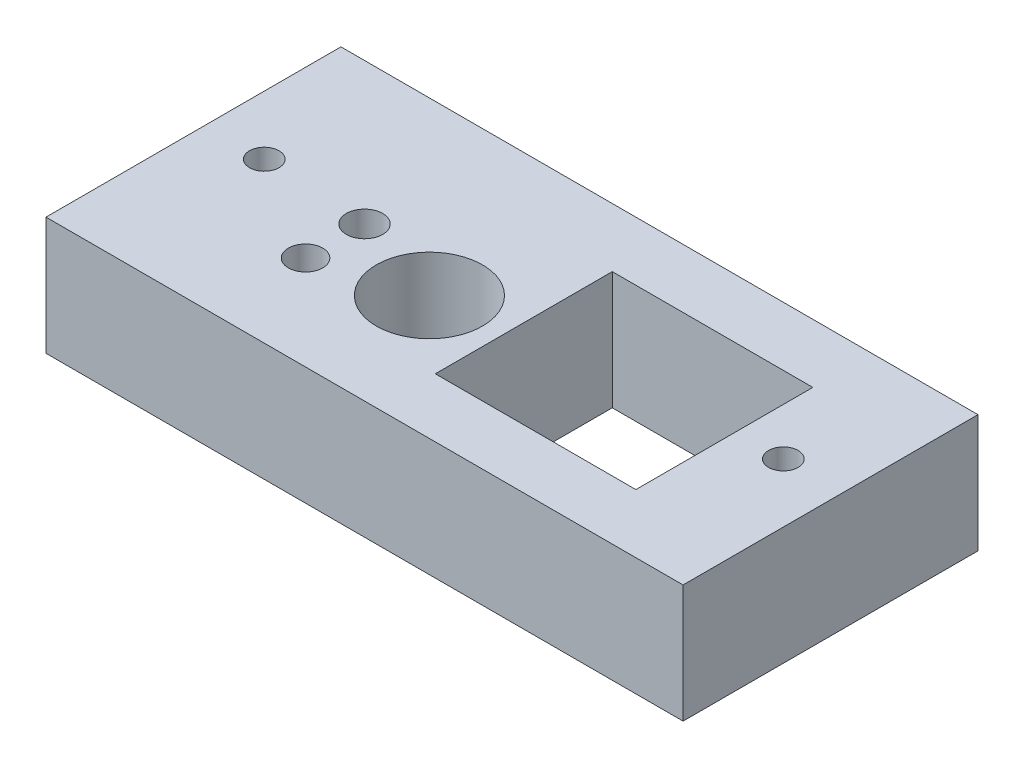
ISO-10303-21;
HEADER;
FILE_DESCRIPTION(('STEP AP214'),'2;1');
FILE_NAME('part.step','',(''),(''),'','','');
FILE_SCHEMA(('AUTOMOTIVE_DESIGN { 1 0 10303 214 1 1 1 1 }'));
ENDSEC;
DATA;
#1=APPLICATION_CONTEXT('core data for automotive mechanical design processes');
#2=APPLICATION_PROTOCOL_DEFINITION('international standard','automotive_design',2000,#1);
#3=PRODUCT_CONTEXT('',#1,'mechanical');
#4=PRODUCT('Part','Part','',(#3));
#5=PRODUCT_RELATED_PRODUCT_CATEGORY('part','',(#4));
#6=PRODUCT_DEFINITION_FORMATION('','',#4);
#7=PRODUCT_DEFINITION_CONTEXT('part definition',#1,'design');
#8=PRODUCT_DEFINITION('design','',#6,#7);
#9=PRODUCT_DEFINITION_SHAPE('','',#8);
#10=(LENGTH_UNIT() NAMED_UNIT(*) SI_UNIT(.MILLI.,.METRE.));
#11=(NAMED_UNIT(*) PLANE_ANGLE_UNIT() SI_UNIT($,.RADIAN.));
#12=(NAMED_UNIT(*) SI_UNIT($,.STERADIAN.) SOLID_ANGLE_UNIT());
#13=UNCERTAINTY_MEASURE_WITH_UNIT(LENGTH_MEASURE(1.E-05),#10,'distance_accuracy_value','');
#14=(GEOMETRIC_REPRESENTATION_CONTEXT(3) GLOBAL_UNCERTAINTY_ASSIGNED_CONTEXT((#13)) GLOBAL_UNIT_ASSIGNED_CONTEXT((#10,
#11,#12)) REPRESENTATION_CONTEXT('',''));
#15=CARTESIAN_POINT('',(0.,0.,0.));
#16=DIRECTION('',(0.,0.,1.));
#17=DIRECTION('',(1.,0.,0.));
#18=AXIS2_PLACEMENT_3D('',#15,#16,#17);
#19=CARTESIAN_POINT('',(0.,10.,0.));
#20=DIRECTION('',(1.,0.,0.));
#21=DIRECTION('',(0.,0.,-1.));
#22=AXIS2_PLACEMENT_3D('',#19,#20,#21);
#23=PLANE('',#22);
#24=DIRECTION('',(0.,0.,1.));
#25=VECTOR('',#24,1.);
#26=CARTESIAN_POINT('',(0.,0.,0.));
#27=LINE('',#26,#25);
#28=CARTESIAN_POINT('',(0.,0.,-25.));
#29=VERTEX_POINT('',#28);
#30=CARTESIAN_POINT('',(0.,0.,0.));
#31=VERTEX_POINT('',#30);
#32=EDGE_CURVE('E134',#29,#31,#27,.T.);
#33=ORIENTED_EDGE('',*,*,#32,.T.);
#34=DIRECTION('',(0.,-1.,0.));
#35=VECTOR('',#34,1.);
#36=CARTESIAN_POINT('',(0.,10.,0.));
#37=LINE('',#36,#35);
#38=CARTESIAN_POINT('',(0.,10.,0.));
#39=VERTEX_POINT('',#38);
#40=EDGE_CURVE('E11',#39,#31,#37,.T.);
#41=ORIENTED_EDGE('',*,*,#40,.F.);
#42=DIRECTION('',(0.,0.,1.));
#43=VECTOR('',#42,1.);
#44=CARTESIAN_POINT('',(0.,10.,0.));
#45=LINE('',#44,#43);
#46=CARTESIAN_POINT('',(0.,10.,-25.));
#47=VERTEX_POINT('',#46);
#48=EDGE_CURVE('E138',#47,#39,#45,.T.);
#49=ORIENTED_EDGE('',*,*,#48,.F.);
#50=DIRECTION('',(0.,-1.,0.));
#51=VECTOR('',#50,1.);
#52=CARTESIAN_POINT('',(0.,10.,-25.));
#53=LINE('',#52,#51);
#54=EDGE_CURVE('E148',#47,#29,#53,.T.);
#55=ORIENTED_EDGE('',*,*,#54,.T.);
#56=EDGE_LOOP('',(#33,#41,#49,#55));
#57=FACE_BOUND('',#56,.T.);
#58=ADVANCED_FACE('F33',(#57),#23,.F.);
#59=CARTESIAN_POINT('',(0.,10.,0.));
#60=DIRECTION('',(0.,0.,-1.));
#61=DIRECTION('',(-1.,0.,0.));
#62=AXIS2_PLACEMENT_3D('',#59,#60,#61);
#63=PLANE('',#62);
#64=DIRECTION('',(1.,0.,0.));
#65=VECTOR('',#64,1.);
#66=CARTESIAN_POINT('',(0.,0.,0.));
#67=LINE('',#66,#65);
#68=CARTESIAN_POINT('',(54.,0.,0.));
#69=VERTEX_POINT('',#68);
#70=EDGE_CURVE('E151',#31,#69,#67,.T.);
#71=ORIENTED_EDGE('',*,*,#70,.T.);
#72=DIRECTION('',(0.,-1.,0.));
#73=VECTOR('',#72,1.);
#74=CARTESIAN_POINT('',(54.,10.,0.));
#75=LINE('',#74,#73);
#76=CARTESIAN_POINT('',(54.,10.,0.));
#77=VERTEX_POINT('',#76);
#78=EDGE_CURVE('E40',#77,#69,#75,.T.);
#79=ORIENTED_EDGE('',*,*,#78,.F.);
#80=DIRECTION('',(1.,0.,0.));
#81=VECTOR('',#80,1.);
#82=CARTESIAN_POINT('',(0.,10.,0.));
#83=LINE('',#82,#81);
#84=EDGE_CURVE('E141',#39,#77,#83,.T.);
#85=ORIENTED_EDGE('',*,*,#84,.F.);
#86=ORIENTED_EDGE('',*,*,#40,.T.);
#87=EDGE_LOOP('',(#71,#79,#85,#86));
#88=FACE_BOUND('',#87,.T.);
#89=ADVANCED_FACE('F179',(#88),#63,.F.);
#90=CARTESIAN_POINT('',(54.,10.,0.));
#91=DIRECTION('',(-1.,0.,0.));
#92=DIRECTION('',(0.,0.,1.));
#93=AXIS2_PLACEMENT_3D('',#90,#91,#92);
#94=PLANE('',#93);
#95=DIRECTION('',(0.,0.,-1.));
#96=VECTOR('',#95,1.);
#97=CARTESIAN_POINT('',(54.,0.,0.));
#98=LINE('',#97,#96);
#99=CARTESIAN_POINT('',(54.,0.,-25.));
#100=VERTEX_POINT('',#99);
#101=EDGE_CURVE('E153',#69,#100,#98,.T.);
#102=ORIENTED_EDGE('',*,*,#101,.T.);
#103=DIRECTION('',(0.,-1.,0.));
#104=VECTOR('',#103,1.);
#105=CARTESIAN_POINT('',(54.,10.,-25.));
#106=LINE('',#105,#104);
#107=CARTESIAN_POINT('',(54.,10.,-25.));
#108=VERTEX_POINT('',#107);
#109=EDGE_CURVE('E158',#108,#100,#106,.T.);
#110=ORIENTED_EDGE('',*,*,#109,.F.);
#111=DIRECTION('',(0.,0.,-1.));
#112=VECTOR('',#111,1.);
#113=CARTESIAN_POINT('',(54.,10.,0.));
#114=LINE('',#113,#112);
#115=EDGE_CURVE('E144',#77,#108,#114,.T.);
#116=ORIENTED_EDGE('',*,*,#115,.F.);
#117=ORIENTED_EDGE('',*,*,#78,.T.);
#118=EDGE_LOOP('',(#102,#110,#116,#117));
#119=FACE_BOUND('',#118,.T.);
#120=ADVANCED_FACE('F165',(#119),#94,.F.);
#121=CARTESIAN_POINT('',(0.,10.,-25.));
#122=DIRECTION('',(0.,0.,1.));
#123=DIRECTION('',(1.,0.,0.));
#124=AXIS2_PLACEMENT_3D('',#121,#122,#123);
#125=PLANE('',#124);
#126=DIRECTION('',(-1.,0.,0.));
#127=VECTOR('',#126,1.);
#128=CARTESIAN_POINT('',(0.,0.,-25.));
#129=LINE('',#128,#127);
#130=EDGE_CURVE('E142',#100,#29,#129,.T.);
#131=ORIENTED_EDGE('',*,*,#130,.T.);
#132=ORIENTED_EDGE('',*,*,#54,.F.);
#133=DIRECTION('',(-1.,0.,0.));
#134=VECTOR('',#133,1.);
#135=CARTESIAN_POINT('',(0.,10.,-25.));
#136=LINE('',#135,#134);
#137=EDGE_CURVE('E146',#108,#47,#136,.T.);
#138=ORIENTED_EDGE('',*,*,#137,.F.);
#139=ORIENTED_EDGE('',*,*,#109,.T.);
#140=EDGE_LOOP('',(#131,#132,#138,#139));
#141=FACE_BOUND('',#140,.T.);
#142=ADVANCED_FACE('F172',(#141),#125,.F.);
#143=CARTESIAN_POINT('',(0.,10.,0.));
#144=DIRECTION('',(0.,-1.,0.));
#145=DIRECTION('',(0.,0.,-1.));
#146=AXIS2_PLACEMENT_3D('',#143,#144,#145);
#147=PLANE('',#146);
#148=CARTESIAN_POINT('',(14.,10.,-8.));
#149=DIRECTION('',(0.,1.,0.));
#150=DIRECTION('',(0.,0.,1.));
#151=AXIS2_PLACEMENT_3D('',#148,#149,#150);
#152=CIRCLE('',#151,1.45734545201175);
#153=CARTESIAN_POINT('',(14.,10.,-6.54265454798825));
#154=VERTEX_POINT('',#153);
#155=EDGE_CURVE('E233',#154,#154,#152,.T.);
#156=ORIENTED_EDGE('',*,*,#155,.F.);
#157=EDGE_LOOP('',(#156));
#158=FACE_BOUND('',#157,.T.);
#159=CARTESIAN_POINT('',(14.,10.,-13.));
#160=DIRECTION('',(0.,1.,0.));
#161=DIRECTION('',(0.,0.,1.));
#162=AXIS2_PLACEMENT_3D('',#159,#160,#161);
#163=CIRCLE('',#162,1.54169225657886);
#164=CARTESIAN_POINT('',(14.,10.,-11.4583077434211));
#165=VERTEX_POINT('',#164);
#166=EDGE_CURVE('E235',#165,#165,#163,.T.);
#167=ORIENTED_EDGE('',*,*,#166,.F.);
#168=EDGE_LOOP('',(#167));
#169=FACE_BOUND('',#168,.T.);
#170=CARTESIAN_POINT('',(22.,10.,-10.5));
#171=DIRECTION('',(0.,1.,0.));
#172=DIRECTION('',(0.,0.,1.));
#173=AXIS2_PLACEMENT_3D('',#170,#171,#172);
#174=CIRCLE('',#173,4.5);
#175=CARTESIAN_POINT('',(22.,10.,-6.));
#176=VERTEX_POINT('',#175);
#177=EDGE_CURVE('E241',#176,#176,#174,.T.);
#178=ORIENTED_EDGE('',*,*,#177,.F.);
#179=EDGE_LOOP('',(#178));
#180=FACE_BOUND('',#179,.T.);
#181=CARTESIAN_POINT('',(5.,10.,-13.5));
#182=DIRECTION('',(0.,1.,0.));
#183=DIRECTION('',(0.,0.,1.));
#184=AXIS2_PLACEMENT_3D('',#181,#182,#183);
#185=CIRCLE('',#184,1.25);
#186=CARTESIAN_POINT('',(5.,10.,-12.25));
#187=VERTEX_POINT('',#186);
#188=EDGE_CURVE('E247',#187,#187,#185,.T.);
#189=ORIENTED_EDGE('',*,*,#188,.F.);
#190=EDGE_LOOP('',(#189));
#191=FACE_BOUND('',#190,.T.);
#192=CARTESIAN_POINT('',(49.,10.,-13.5));
#193=DIRECTION('',(0.,1.,0.));
#194=DIRECTION('',(0.,0.,1.));
#195=AXIS2_PLACEMENT_3D('',#192,#193,#194);
#196=CIRCLE('',#195,1.25);
#197=CARTESIAN_POINT('',(49.,10.,-12.25));
#198=VERTEX_POINT('',#197);
#199=EDGE_CURVE('E121',#198,#198,#196,.T.);
#200=ORIENTED_EDGE('',*,*,#199,.F.);
#201=EDGE_LOOP('',(#200));
#202=FACE_BOUND('',#201,.T.);
#203=DIRECTION('',(1.,0.,0.));
#204=VECTOR('',#203,1.);
#205=CARTESIAN_POINT('',(28.,10.,-5.));
#206=LINE('',#205,#204);
#207=CARTESIAN_POINT('',(28.,10.,-5.));
#208=VERTEX_POINT('',#207);
#209=CARTESIAN_POINT('',(45.,10.,-5.));
#210=VERTEX_POINT('',#209);
#211=EDGE_CURVE('E127',#208,#210,#206,.T.);
#212=ORIENTED_EDGE('',*,*,#211,.F.);
#213=DIRECTION('',(0.,0.,1.));
#214=VECTOR('',#213,1.);
#215=CARTESIAN_POINT('',(28.,10.,-20.));
#216=LINE('',#215,#214);
#217=CARTESIAN_POINT('',(28.,10.,-20.));
#218=VERTEX_POINT('',#217);
#219=EDGE_CURVE('E47',#218,#208,#216,.T.);
#220=ORIENTED_EDGE('',*,*,#219,.F.);
#221=DIRECTION('',(-1.,0.,0.));
#222=VECTOR('',#221,1.);
#223=CARTESIAN_POINT('',(28.,10.,-20.));
#224=LINE('',#223,#222);
#225=CARTESIAN_POINT('',(45.,10.,-20.));
#226=VERTEX_POINT('',#225);
#227=EDGE_CURVE('E115',#226,#218,#224,.T.);
#228=ORIENTED_EDGE('',*,*,#227,.F.);
#229=DIRECTION('',(0.,0.,-1.));
#230=VECTOR('',#229,1.);
#231=CARTESIAN_POINT('',(45.,10.,-20.));
#232=LINE('',#231,#230);
#233=EDGE_CURVE('E118',#210,#226,#232,.T.);
#234=ORIENTED_EDGE('',*,*,#233,.F.);
#235=EDGE_LOOP('',(#212,#220,#228,#234));
#236=FACE_BOUND('',#235,.T.);
#237=ORIENTED_EDGE('',*,*,#48,.T.);
#238=ORIENTED_EDGE('',*,*,#84,.T.);
#239=ORIENTED_EDGE('',*,*,#115,.T.);
#240=ORIENTED_EDGE('',*,*,#137,.T.);
#241=EDGE_LOOP('',(#237,#238,#239,#240));
#242=FACE_BOUND('',#241,.T.);
#243=ADVANCED_FACE('F178',(#158,#169,#180,#191,#202,#236,#242),#147,.F.);
#244=CARTESIAN_POINT('',(0.,0.,0.));
#245=DIRECTION('',(0.,-1.,0.));
#246=DIRECTION('',(0.,0.,-1.));
#247=AXIS2_PLACEMENT_3D('',#244,#245,#246);
#248=PLANE('',#247);
#249=CARTESIAN_POINT('',(14.,0.,-8.));
#250=DIRECTION('',(0.,1.,0.));
#251=DIRECTION('',(0.,0.,1.));
#252=AXIS2_PLACEMENT_3D('',#249,#250,#251);
#253=CIRCLE('',#252,1.45734545201175);
#254=CARTESIAN_POINT('',(14.,0.,-6.54265454798825));
#255=VERTEX_POINT('',#254);
#256=EDGE_CURVE('E230',#255,#255,#253,.T.);
#257=ORIENTED_EDGE('',*,*,#256,.T.);
#258=EDGE_LOOP('',(#257));
#259=FACE_BOUND('',#258,.T.);
#260=CARTESIAN_POINT('',(14.,0.,-13.));
#261=DIRECTION('',(0.,1.,0.));
#262=DIRECTION('',(0.,0.,1.));
#263=AXIS2_PLACEMENT_3D('',#260,#261,#262);
#264=CIRCLE('',#263,1.54169225657886);
#265=CARTESIAN_POINT('',(14.,0.,-11.4583077434211));
#266=VERTEX_POINT('',#265);
#267=EDGE_CURVE('E238',#266,#266,#264,.T.);
#268=ORIENTED_EDGE('',*,*,#267,.T.);
#269=EDGE_LOOP('',(#268));
#270=FACE_BOUND('',#269,.T.);
#271=CARTESIAN_POINT('',(22.,0.,-10.5));
#272=DIRECTION('',(0.,1.,0.));
#273=DIRECTION('',(0.,0.,1.));
#274=AXIS2_PLACEMENT_3D('',#271,#272,#273);
#275=CIRCLE('',#274,4.5);
#276=CARTESIAN_POINT('',(22.,0.,-6.));
#277=VERTEX_POINT('',#276);
#278=EDGE_CURVE('E244',#277,#277,#275,.T.);
#279=ORIENTED_EDGE('',*,*,#278,.T.);
#280=EDGE_LOOP('',(#279));
#281=FACE_BOUND('',#280,.T.);
#282=CARTESIAN_POINT('',(5.,0.,-13.5));
#283=DIRECTION('',(0.,1.,0.));
#284=DIRECTION('',(0.,0.,1.));
#285=AXIS2_PLACEMENT_3D('',#282,#283,#284);
#286=CIRCLE('',#285,1.25);
#287=CARTESIAN_POINT('',(5.,0.,-12.25));
#288=VERTEX_POINT('',#287);
#289=EDGE_CURVE('E250',#288,#288,#286,.T.);
#290=ORIENTED_EDGE('',*,*,#289,.T.);
#291=EDGE_LOOP('',(#290));
#292=FACE_BOUND('',#291,.T.);
#293=CARTESIAN_POINT('',(49.,0.,-13.5));
#294=DIRECTION('',(0.,1.,0.));
#295=DIRECTION('',(0.,0.,1.));
#296=AXIS2_PLACEMENT_3D('',#293,#294,#295);
#297=CIRCLE('',#296,1.25);
#298=CARTESIAN_POINT('',(49.,0.,-12.25));
#299=VERTEX_POINT('',#298);
#300=EDGE_CURVE('E128',#299,#299,#297,.T.);
#301=ORIENTED_EDGE('',*,*,#300,.T.);
#302=EDGE_LOOP('',(#301));
#303=FACE_BOUND('',#302,.T.);
#304=DIRECTION('',(0.,0.,1.));
#305=VECTOR('',#304,1.);
#306=CARTESIAN_POINT('',(28.,0.,-20.));
#307=LINE('',#306,#305);
#308=CARTESIAN_POINT('',(28.,0.,-20.));
#309=VERTEX_POINT('',#308);
#310=CARTESIAN_POINT('',(28.,0.,-5.));
#311=VERTEX_POINT('',#310);
#312=EDGE_CURVE('E99',#309,#311,#307,.T.);
#313=ORIENTED_EDGE('',*,*,#312,.T.);
#314=DIRECTION('',(1.,0.,0.));
#315=VECTOR('',#314,1.);
#316=CARTESIAN_POINT('',(28.,0.,-5.));
#317=LINE('',#316,#315);
#318=CARTESIAN_POINT('',(45.,0.,-5.));
#319=VERTEX_POINT('',#318);
#320=EDGE_CURVE('E108',#311,#319,#317,.T.);
#321=ORIENTED_EDGE('',*,*,#320,.T.);
#322=DIRECTION('',(0.,0.,-1.));
#323=VECTOR('',#322,1.);
#324=CARTESIAN_POINT('',(45.,0.,-20.));
#325=LINE('',#324,#323);
#326=CARTESIAN_POINT('',(45.,0.,-20.));
#327=VERTEX_POINT('',#326);
#328=EDGE_CURVE('E55',#319,#327,#325,.T.);
#329=ORIENTED_EDGE('',*,*,#328,.T.);
#330=DIRECTION('',(-1.,0.,0.));
#331=VECTOR('',#330,1.);
#332=CARTESIAN_POINT('',(28.,0.,-20.));
#333=LINE('',#332,#331);
#334=EDGE_CURVE('E105',#327,#309,#333,.T.);
#335=ORIENTED_EDGE('',*,*,#334,.T.);
#336=EDGE_LOOP('',(#313,#321,#329,#335));
#337=FACE_BOUND('',#336,.T.);
#338=ORIENTED_EDGE('',*,*,#32,.F.);
#339=ORIENTED_EDGE('',*,*,#130,.F.);
#340=ORIENTED_EDGE('',*,*,#101,.F.);
#341=ORIENTED_EDGE('',*,*,#70,.F.);
#342=EDGE_LOOP('',(#338,#339,#340,#341));
#343=FACE_BOUND('',#342,.T.);
#344=ADVANCED_FACE('F112',(#259,#270,#281,#292,#303,#337,#343),#248,.T.);
#345=CARTESIAN_POINT('',(28.,0.,-20.));
#346=DIRECTION('',(-1.,0.,0.));
#347=DIRECTION('',(0.,0.,1.));
#348=AXIS2_PLACEMENT_3D('',#345,#346,#347);
#349=PLANE('',#348);
#350=ORIENTED_EDGE('',*,*,#219,.T.);
#351=DIRECTION('',(0.,1.,0.));
#352=VECTOR('',#351,1.);
#353=CARTESIAN_POINT('',(28.,0.,-5.));
#354=LINE('',#353,#352);
#355=EDGE_CURVE('E95',#311,#208,#354,.T.);
#356=ORIENTED_EDGE('',*,*,#355,.F.);
#357=ORIENTED_EDGE('',*,*,#312,.F.);
#358=DIRECTION('',(0.,1.,0.));
#359=VECTOR('',#358,1.);
#360=CARTESIAN_POINT('',(28.,0.,-20.));
#361=LINE('',#360,#359);
#362=EDGE_CURVE('E132',#309,#218,#361,.T.);
#363=ORIENTED_EDGE('',*,*,#362,.T.);
#364=EDGE_LOOP('',(#350,#356,#357,#363));
#365=FACE_BOUND('',#364,.T.);
#366=ADVANCED_FACE('F97',(#365),#349,.F.);
#367=CARTESIAN_POINT('',(28.,0.,-20.));
#368=DIRECTION('',(0.,0.,-1.));
#369=DIRECTION('',(-1.,0.,0.));
#370=AXIS2_PLACEMENT_3D('',#367,#368,#369);
#371=PLANE('',#370);
#372=ORIENTED_EDGE('',*,*,#227,.T.);
#373=ORIENTED_EDGE('',*,*,#362,.F.);
#374=ORIENTED_EDGE('',*,*,#334,.F.);
#375=DIRECTION('',(0.,1.,0.));
#376=VECTOR('',#375,1.);
#377=CARTESIAN_POINT('',(45.,0.,-20.));
#378=LINE('',#377,#376);
#379=EDGE_CURVE('E135',#327,#226,#378,.T.);
#380=ORIENTED_EDGE('',*,*,#379,.T.);
#381=EDGE_LOOP('',(#372,#373,#374,#380));
#382=FACE_BOUND('',#381,.T.);
#383=ADVANCED_FACE('F197',(#382),#371,.F.);
#384=CARTESIAN_POINT('',(45.,0.,-20.));
#385=DIRECTION('',(1.,0.,0.));
#386=DIRECTION('',(0.,0.,-1.));
#387=AXIS2_PLACEMENT_3D('',#384,#385,#386);
#388=PLANE('',#387);
#389=ORIENTED_EDGE('',*,*,#233,.T.);
#390=ORIENTED_EDGE('',*,*,#379,.F.);
#391=ORIENTED_EDGE('',*,*,#328,.F.);
#392=DIRECTION('',(0.,1.,0.));
#393=VECTOR('',#392,1.);
#394=CARTESIAN_POINT('',(45.,0.,-5.));
#395=LINE('',#394,#393);
#396=EDGE_CURVE('E104',#319,#210,#395,.T.);
#397=ORIENTED_EDGE('',*,*,#396,.T.);
#398=EDGE_LOOP('',(#389,#390,#391,#397));
#399=FACE_BOUND('',#398,.T.);
#400=ADVANCED_FACE('F201',(#399),#388,.F.);
#401=CARTESIAN_POINT('',(28.,0.,-5.));
#402=DIRECTION('',(0.,0.,1.));
#403=DIRECTION('',(1.,0.,0.));
#404=AXIS2_PLACEMENT_3D('',#401,#402,#403);
#405=PLANE('',#404);
#406=ORIENTED_EDGE('',*,*,#211,.T.);
#407=ORIENTED_EDGE('',*,*,#396,.F.);
#408=ORIENTED_EDGE('',*,*,#320,.F.);
#409=ORIENTED_EDGE('',*,*,#355,.T.);
#410=EDGE_LOOP('',(#406,#407,#408,#409));
#411=FACE_BOUND('',#410,.T.);
#412=ADVANCED_FACE('F109',(#411),#405,.F.);
#413=CARTESIAN_POINT('',(49.,0.,-13.5));
#414=DIRECTION('',(0.,1.,0.));
#415=DIRECTION('',(0.,0.,1.));
#416=AXIS2_PLACEMENT_3D('',#413,#414,#415);
#417=CYLINDRICAL_SURFACE('',#416,1.25);
#418=ORIENTED_EDGE('',*,*,#300,.F.);
#419=EDGE_LOOP('',(#418));
#420=FACE_BOUND('',#419,.T.);
#421=ORIENTED_EDGE('',*,*,#199,.T.);
#422=EDGE_LOOP('',(#421));
#423=FACE_BOUND('',#422,.T.);
#424=ADVANCED_FACE('F200',(#420,#423),#417,.F.);
#425=CARTESIAN_POINT('',(5.,0.,-13.5));
#426=DIRECTION('',(0.,1.,0.));
#427=DIRECTION('',(0.,0.,1.));
#428=AXIS2_PLACEMENT_3D('',#425,#426,#427);
#429=CYLINDRICAL_SURFACE('',#428,1.25);
#430=ORIENTED_EDGE('',*,*,#289,.F.);
#431=EDGE_LOOP('',(#430));
#432=FACE_BOUND('',#431,.T.);
#433=ORIENTED_EDGE('',*,*,#188,.T.);
#434=EDGE_LOOP('',(#433));
#435=FACE_BOUND('',#434,.T.);
#436=ADVANCED_FACE('F209',(#432,#435),#429,.F.);
#437=CARTESIAN_POINT('',(22.,0.,-10.5));
#438=DIRECTION('',(0.,1.,0.));
#439=DIRECTION('',(0.,0.,1.));
#440=AXIS2_PLACEMENT_3D('',#437,#438,#439);
#441=CYLINDRICAL_SURFACE('',#440,4.5);
#442=ORIENTED_EDGE('',*,*,#278,.F.);
#443=EDGE_LOOP('',(#442));
#444=FACE_BOUND('',#443,.T.);
#445=ORIENTED_EDGE('',*,*,#177,.T.);
#446=EDGE_LOOP('',(#445));
#447=FACE_BOUND('',#446,.T.);
#448=ADVANCED_FACE('F213',(#444,#447),#441,.F.);
#449=CARTESIAN_POINT('',(14.,0.,-13.));
#450=DIRECTION('',(0.,1.,0.));
#451=DIRECTION('',(0.,0.,1.));
#452=AXIS2_PLACEMENT_3D('',#449,#450,#451);
#453=CYLINDRICAL_SURFACE('',#452,1.54169225657886);
#454=ORIENTED_EDGE('',*,*,#267,.F.);
#455=EDGE_LOOP('',(#454));
#456=FACE_BOUND('',#455,.T.);
#457=ORIENTED_EDGE('',*,*,#166,.T.);
#458=EDGE_LOOP('',(#457));
#459=FACE_BOUND('',#458,.T.);
#460=ADVANCED_FACE('F217',(#456,#459),#453,.F.);
#461=CARTESIAN_POINT('',(14.,0.,-8.));
#462=DIRECTION('',(0.,1.,0.));
#463=DIRECTION('',(0.,0.,1.));
#464=AXIS2_PLACEMENT_3D('',#461,#462,#463);
#465=CYLINDRICAL_SURFACE('',#464,1.45734545201175);
#466=ORIENTED_EDGE('',*,*,#256,.F.);
#467=EDGE_LOOP('',(#466));
#468=FACE_BOUND('',#467,.T.);
#469=ORIENTED_EDGE('',*,*,#155,.T.);
#470=EDGE_LOOP('',(#469));
#471=FACE_BOUND('',#470,.T.);
#472=ADVANCED_FACE('F221',(#468,#471),#465,.F.);
#473=CLOSED_SHELL('',(#58,#89,#120,#142,#243,#344,#366,#383,#400,#412,#424,#436,#448,#460,#472));
#474=MANIFOLD_SOLID_BREP('B2',#473);
#475=ADVANCED_BREP_SHAPE_REPRESENTATION('',(#18,#474),#14);
#476=SHAPE_DEFINITION_REPRESENTATION(#9,#475);
ENDSEC;
END-ISO-10303-21;
